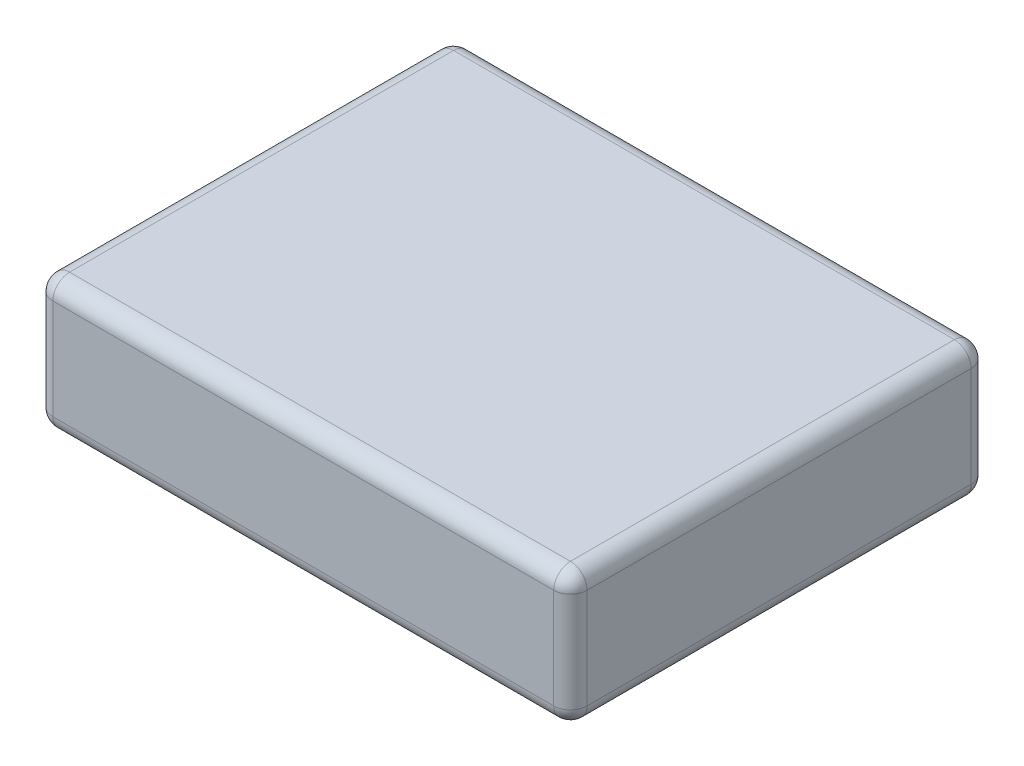
ISO-10303-21;
HEADER;
FILE_DESCRIPTION(('STEP AP214'),'2;1');
FILE_NAME('part.step','',(''),(''),'','','');
FILE_SCHEMA(('AUTOMOTIVE_DESIGN { 1 0 10303 214 1 1 1 1 }'));
ENDSEC;
DATA;
#1=APPLICATION_CONTEXT('core data for automotive mechanical design processes');
#2=APPLICATION_PROTOCOL_DEFINITION('international standard','automotive_design',2000,#1);
#3=PRODUCT_CONTEXT('',#1,'mechanical');
#4=PRODUCT('Part','Part','',(#3));
#5=PRODUCT_RELATED_PRODUCT_CATEGORY('part','',(#4));
#6=PRODUCT_DEFINITION_FORMATION('','',#4);
#7=PRODUCT_DEFINITION_CONTEXT('part definition',#1,'design');
#8=PRODUCT_DEFINITION('design','',#6,#7);
#9=PRODUCT_DEFINITION_SHAPE('','',#8);
#10=(LENGTH_UNIT() NAMED_UNIT(*) SI_UNIT(.MILLI.,.METRE.));
#11=(NAMED_UNIT(*) PLANE_ANGLE_UNIT() SI_UNIT($,.RADIAN.));
#12=(NAMED_UNIT(*) SI_UNIT($,.STERADIAN.) SOLID_ANGLE_UNIT());
#13=UNCERTAINTY_MEASURE_WITH_UNIT(LENGTH_MEASURE(1.E-05),#10,'distance_accuracy_value','');
#14=(GEOMETRIC_REPRESENTATION_CONTEXT(3) GLOBAL_UNCERTAINTY_ASSIGNED_CONTEXT((#13)) GLOBAL_UNIT_ASSIGNED_CONTEXT((#10,
#11,#12)) REPRESENTATION_CONTEXT('',''));
#15=CARTESIAN_POINT('',(0.,0.,0.));
#16=DIRECTION('',(0.,0.,1.));
#17=DIRECTION('',(1.,0.,0.));
#18=AXIS2_PLACEMENT_3D('',#15,#16,#17);
#19=CARTESIAN_POINT('',(15.,97.,-6.5));
#20=DIRECTION('',(0.,-1.,0.));
#21=DIRECTION('',(1.,0.,0.));
#22=AXIS2_PLACEMENT_3D('',#19,#20,#21);
#23=SPHERICAL_SURFACE('',#22,1.);
#24=CARTESIAN_POINT('',(15.,97.,-6.5));
#25=DIRECTION('',(0.,0.,-1.));
#26=DIRECTION('',(1.,0.,0.));
#27=AXIS2_PLACEMENT_3D('',#24,#25,#26);
#28=CIRCLE('',#27,1.);
#29=CARTESIAN_POINT('',(15.,98.,-6.5));
#30=VERTEX_POINT('',#29);
#31=CARTESIAN_POINT('',(16.,97.,-6.5));
#32=VERTEX_POINT('',#31);
#33=EDGE_CURVE('E10',#30,#32,#28,.T.);
#34=ORIENTED_EDGE('',*,*,#33,.F.);
#35=CARTESIAN_POINT('',(15.,97.,-6.5));
#36=DIRECTION('',(1.,0.,0.));
#37=DIRECTION('',(0.,0.,1.));
#38=AXIS2_PLACEMENT_3D('',#35,#36,#37);
#39=CIRCLE('',#38,1.);
#40=CARTESIAN_POINT('',(15.,97.,-5.5));
#41=VERTEX_POINT('',#40);
#42=EDGE_CURVE('E309',#30,#41,#39,.T.);
#43=ORIENTED_EDGE('',*,*,#42,.T.);
#44=CARTESIAN_POINT('',(15.,97.,-6.5));
#45=DIRECTION('',(0.,-1.,0.));
#46=DIRECTION('',(1.,0.,0.));
#47=AXIS2_PLACEMENT_3D('',#44,#45,#46);
#48=CIRCLE('',#47,1.);
#49=EDGE_CURVE('E317',#32,#41,#48,.T.);
#50=ORIENTED_EDGE('',*,*,#49,.F.);
#51=EDGE_LOOP('',(#34,#43,#50));
#52=FACE_BOUND('',#51,.T.);
#53=ADVANCED_FACE('F16',(#52),#23,.T.);
#54=CARTESIAN_POINT('',(15.,97.,-29.5));
#55=DIRECTION('',(0.,0.,1.));
#56=DIRECTION('',(1.,0.,0.));
#57=AXIS2_PLACEMENT_3D('',#54,#55,#56);
#58=SPHERICAL_SURFACE('',#57,1.);
#59=CARTESIAN_POINT('',(15.,97.,-29.5));
#60=DIRECTION('',(0.,-1.,0.));
#61=DIRECTION('',(1.,0.,0.));
#62=AXIS2_PLACEMENT_3D('',#59,#60,#61);
#63=CIRCLE('',#62,1.);
#64=CARTESIAN_POINT('',(15.,97.,-30.5));
#65=VERTEX_POINT('',#64);
#66=CARTESIAN_POINT('',(16.,97.,-29.5));
#67=VERTEX_POINT('',#66);
#68=EDGE_CURVE('E301',#65,#67,#63,.T.);
#69=ORIENTED_EDGE('',*,*,#68,.F.);
#70=CARTESIAN_POINT('',(15.,97.,-29.5));
#71=DIRECTION('',(1.,0.,0.));
#72=DIRECTION('',(0.,1.,0.));
#73=AXIS2_PLACEMENT_3D('',#70,#71,#72);
#74=CIRCLE('',#73,1.);
#75=CARTESIAN_POINT('',(15.,98.,-29.5));
#76=VERTEX_POINT('',#75);
#77=EDGE_CURVE('E221',#65,#76,#74,.T.);
#78=ORIENTED_EDGE('',*,*,#77,.T.);
#79=CARTESIAN_POINT('',(15.,97.,-29.5));
#80=DIRECTION('',(0.,0.,1.));
#81=DIRECTION('',(1.,0.,0.));
#82=AXIS2_PLACEMENT_3D('',#79,#80,#81);
#83=CIRCLE('',#82,1.);
#84=EDGE_CURVE('E24',#67,#76,#83,.T.);
#85=ORIENTED_EDGE('',*,*,#84,.F.);
#86=EDGE_LOOP('',(#69,#78,#85));
#87=FACE_BOUND('',#86,.T.);
#88=ADVANCED_FACE('F326',(#87),#58,.T.);
#89=CARTESIAN_POINT('',(16.,90.,-30.5));
#90=DIRECTION('',(1.,0.,0.));
#91=DIRECTION('',(0.,1.,0.));
#92=AXIS2_PLACEMENT_3D('',#89,#90,#91);
#93=PLANE('',#92);
#94=DIRECTION('',(0.,0.,1.));
#95=VECTOR('',#94,1.);
#96=CARTESIAN_POINT('',(16.,91.,-30.5));
#97=LINE('',#96,#95);
#98=CARTESIAN_POINT('',(16.,91.,-29.5));
#99=VERTEX_POINT('',#98);
#100=CARTESIAN_POINT('',(16.,91.,-6.5));
#101=VERTEX_POINT('',#100);
#102=EDGE_CURVE('E217',#99,#101,#97,.T.);
#103=ORIENTED_EDGE('',*,*,#102,.F.);
#104=DIRECTION('',(0.,1.,0.));
#105=VECTOR('',#104,1.);
#106=CARTESIAN_POINT('',(16.,90.,-29.5));
#107=LINE('',#106,#105);
#108=EDGE_CURVE('E305',#99,#67,#107,.T.);
#109=ORIENTED_EDGE('',*,*,#108,.T.);
#110=DIRECTION('',(0.,0.,1.));
#111=VECTOR('',#110,1.);
#112=CARTESIAN_POINT('',(16.,97.,-30.5));
#113=LINE('',#112,#111);
#114=EDGE_CURVE('E202',#67,#32,#113,.T.);
#115=ORIENTED_EDGE('',*,*,#114,.T.);
#116=DIRECTION('',(0.,1.,0.));
#117=VECTOR('',#116,1.);
#118=CARTESIAN_POINT('',(16.,90.,-6.5));
#119=LINE('',#118,#117);
#120=EDGE_CURVE('E313',#101,#32,#119,.T.);
#121=ORIENTED_EDGE('',*,*,#120,.F.);
#122=EDGE_LOOP('',(#103,#109,#115,#121));
#123=FACE_BOUND('',#122,.T.);
#124=ADVANCED_FACE('F354',(#123),#93,.T.);
#125=CARTESIAN_POINT('',(15.,91.,-6.5));
#126=DIRECTION('',(0.,0.,-1.));
#127=DIRECTION('',(1.,0.,0.));
#128=AXIS2_PLACEMENT_3D('',#125,#126,#127);
#129=SPHERICAL_SURFACE('',#128,1.);
#130=CARTESIAN_POINT('',(15.,91.,-6.5));
#131=DIRECTION('',(0.,1.,0.));
#132=DIRECTION('',(1.,0.,0.));
#133=AXIS2_PLACEMENT_3D('',#130,#131,#132);
#134=CIRCLE('',#133,1.);
#135=CARTESIAN_POINT('',(15.,91.,-5.5));
#136=VERTEX_POINT('',#135);
#137=EDGE_CURVE('E205',#136,#101,#134,.T.);
#138=ORIENTED_EDGE('',*,*,#137,.F.);
#139=CARTESIAN_POINT('',(15.,91.,-6.5));
#140=DIRECTION('',(1.,0.,0.));
#141=DIRECTION('',(0.,-1.,0.));
#142=AXIS2_PLACEMENT_3D('',#139,#140,#141);
#143=CIRCLE('',#142,1.);
#144=CARTESIAN_POINT('',(15.,90.,-6.5));
#145=VERTEX_POINT('',#144);
#146=EDGE_CURVE('E193',#136,#145,#143,.T.);
#147=ORIENTED_EDGE('',*,*,#146,.T.);
#148=CARTESIAN_POINT('',(15.,91.,-6.5));
#149=DIRECTION('',(0.,0.,-1.));
#150=DIRECTION('',(1.,0.,0.));
#151=AXIS2_PLACEMENT_3D('',#148,#149,#150);
#152=CIRCLE('',#151,1.);
#153=EDGE_CURVE('E210',#101,#145,#152,.T.);
#154=ORIENTED_EDGE('',*,*,#153,.F.);
#155=EDGE_LOOP('',(#138,#147,#154));
#156=FACE_BOUND('',#155,.T.);
#157=ADVANCED_FACE('F358',(#156),#129,.T.);
#158=CARTESIAN_POINT('',(15.,91.,-29.5));
#159=DIRECTION('',(0.,0.,1.));
#160=DIRECTION('',(1.,0.,0.));
#161=AXIS2_PLACEMENT_3D('',#158,#159,#160);
#162=SPHERICAL_SURFACE('',#161,1.);
#163=CARTESIAN_POINT('',(15.,91.,-29.5));
#164=DIRECTION('',(0.,0.,-1.));
#165=DIRECTION('',(1.,0.,0.));
#166=AXIS2_PLACEMENT_3D('',#163,#164,#165);
#167=CIRCLE('',#166,1.);
#168=CARTESIAN_POINT('',(15.,90.,-29.5));
#169=VERTEX_POINT('',#168);
#170=EDGE_CURVE('E213',#99,#169,#167,.T.);
#171=ORIENTED_EDGE('',*,*,#170,.T.);
#172=CARTESIAN_POINT('',(15.,91.,-29.5));
#173=DIRECTION('',(-1.,0.,0.));
#174=DIRECTION('',(0.,-1.,0.));
#175=AXIS2_PLACEMENT_3D('',#172,#173,#174);
#176=CIRCLE('',#175,1.);
#177=CARTESIAN_POINT('',(15.,91.,-30.5));
#178=VERTEX_POINT('',#177);
#179=EDGE_CURVE('E190',#178,#169,#176,.T.);
#180=ORIENTED_EDGE('',*,*,#179,.F.);
#181=CARTESIAN_POINT('',(15.,91.,-29.5));
#182=DIRECTION('',(0.,-1.,0.));
#183=DIRECTION('',(1.,0.,0.));
#184=AXIS2_PLACEMENT_3D('',#181,#182,#183);
#185=CIRCLE('',#184,1.);
#186=EDGE_CURVE('E297',#178,#99,#185,.T.);
#187=ORIENTED_EDGE('',*,*,#186,.T.);
#188=EDGE_LOOP('',(#171,#180,#187));
#189=FACE_BOUND('',#188,.T.);
#190=ADVANCED_FACE('F364',(#189),#162,.T.);
#191=CARTESIAN_POINT('',(15.,97.,-30.5));
#192=DIRECTION('',(0.,0.,1.));
#193=DIRECTION('',(1.,0.,0.));
#194=AXIS2_PLACEMENT_3D('',#191,#192,#193);
#195=CYLINDRICAL_SURFACE('',#194,1.);
#196=ORIENTED_EDGE('',*,*,#114,.F.);
#197=ORIENTED_EDGE('',*,*,#84,.T.);
#198=DIRECTION('',(0.,0.,1.));
#199=VECTOR('',#198,1.);
#200=CARTESIAN_POINT('',(15.,98.,-30.5));
#201=LINE('',#200,#199);
#202=EDGE_CURVE('E287',#76,#30,#201,.T.);
#203=ORIENTED_EDGE('',*,*,#202,.T.);
#204=ORIENTED_EDGE('',*,*,#33,.T.);
#205=EDGE_LOOP('',(#196,#197,#203,#204));
#206=FACE_BOUND('',#205,.T.);
#207=ADVANCED_FACE('F323',(#206),#195,.T.);
#208=CARTESIAN_POINT('',(15.,90.,-6.5));
#209=DIRECTION('',(0.,1.,0.));
#210=DIRECTION('',(1.,0.,0.));
#211=AXIS2_PLACEMENT_3D('',#208,#209,#210);
#212=CYLINDRICAL_SURFACE('',#211,1.);
#213=ORIENTED_EDGE('',*,*,#120,.T.);
#214=ORIENTED_EDGE('',*,*,#49,.T.);
#215=DIRECTION('',(0.,1.,0.));
#216=VECTOR('',#215,1.);
#217=CARTESIAN_POINT('',(15.,90.,-5.5));
#218=LINE('',#217,#216);
#219=EDGE_CURVE('E269',#136,#41,#218,.T.);
#220=ORIENTED_EDGE('',*,*,#219,.F.);
#221=ORIENTED_EDGE('',*,*,#137,.T.);
#222=EDGE_LOOP('',(#213,#214,#220,#221));
#223=FACE_BOUND('',#222,.T.);
#224=ADVANCED_FACE('F345',(#223),#212,.T.);
#225=CARTESIAN_POINT('',(-16.,97.,-6.5));
#226=DIRECTION('',(1.,0.,0.));
#227=DIRECTION('',(0.,1.,0.));
#228=AXIS2_PLACEMENT_3D('',#225,#226,#227);
#229=CYLINDRICAL_SURFACE('',#228,1.);
#230=CARTESIAN_POINT('',(-15.,97.,-6.5));
#231=DIRECTION('',(1.,0.,0.));
#232=DIRECTION('',(0.,0.,1.));
#233=AXIS2_PLACEMENT_3D('',#230,#231,#232);
#234=CIRCLE('',#233,1.);
#235=CARTESIAN_POINT('',(-15.,98.,-6.5));
#236=VERTEX_POINT('',#235);
#237=CARTESIAN_POINT('',(-15.,97.,-5.5));
#238=VERTEX_POINT('',#237);
#239=EDGE_CURVE('E277',#236,#238,#234,.T.);
#240=ORIENTED_EDGE('',*,*,#239,.T.);
#241=DIRECTION('',(1.,0.,0.));
#242=VECTOR('',#241,1.);
#243=CARTESIAN_POINT('',(-16.,97.,-5.5));
#244=LINE('',#243,#242);
#245=EDGE_CURVE('E273',#238,#41,#244,.T.);
#246=ORIENTED_EDGE('',*,*,#245,.T.);
#247=ORIENTED_EDGE('',*,*,#42,.F.);
#248=DIRECTION('',(1.,0.,0.));
#249=VECTOR('',#248,1.);
#250=CARTESIAN_POINT('',(-16.,98.,-6.5));
#251=LINE('',#250,#249);
#252=EDGE_CURVE('E280',#236,#30,#251,.T.);
#253=ORIENTED_EDGE('',*,*,#252,.F.);
#254=EDGE_LOOP('',(#240,#246,#247,#253));
#255=FACE_BOUND('',#254,.T.);
#256=ADVANCED_FACE('F337',(#255),#229,.T.);
#257=CARTESIAN_POINT('',(15.,90.,-29.5));
#258=DIRECTION('',(0.,1.,0.));
#259=DIRECTION('',(1.,0.,0.));
#260=AXIS2_PLACEMENT_3D('',#257,#258,#259);
#261=CYLINDRICAL_SURFACE('',#260,1.);
#262=ORIENTED_EDGE('',*,*,#186,.F.);
#263=DIRECTION('',(0.,1.,0.));
#264=VECTOR('',#263,1.);
#265=CARTESIAN_POINT('',(15.,90.,-30.5));
#266=LINE('',#265,#264);
#267=EDGE_CURVE('E259',#178,#65,#266,.T.);
#268=ORIENTED_EDGE('',*,*,#267,.T.);
#269=ORIENTED_EDGE('',*,*,#68,.T.);
#270=ORIENTED_EDGE('',*,*,#108,.F.);
#271=EDGE_LOOP('',(#262,#268,#269,#270));
#272=FACE_BOUND('',#271,.T.);
#273=ADVANCED_FACE('F373',(#272),#261,.T.);
#274=CARTESIAN_POINT('',(-16.,97.,-29.5));
#275=DIRECTION('',(1.,0.,0.));
#276=DIRECTION('',(0.,1.,0.));
#277=AXIS2_PLACEMENT_3D('',#274,#275,#276);
#278=CYLINDRICAL_SURFACE('',#277,1.);
#279=DIRECTION('',(1.,0.,0.));
#280=VECTOR('',#279,1.);
#281=CARTESIAN_POINT('',(-16.,98.,-29.5));
#282=LINE('',#281,#280);
#283=CARTESIAN_POINT('',(-15.,98.,-29.5));
#284=VERTEX_POINT('',#283);
#285=EDGE_CURVE('E194',#284,#76,#282,.T.);
#286=ORIENTED_EDGE('',*,*,#285,.T.);
#287=ORIENTED_EDGE('',*,*,#77,.F.);
#288=DIRECTION('',(1.,0.,0.));
#289=VECTOR('',#288,1.);
#290=CARTESIAN_POINT('',(-16.,97.,-30.5));
#291=LINE('',#290,#289);
#292=CARTESIAN_POINT('',(-15.,97.,-30.5));
#293=VERTEX_POINT('',#292);
#294=EDGE_CURVE('E255',#293,#65,#291,.T.);
#295=ORIENTED_EDGE('',*,*,#294,.F.);
#296=CARTESIAN_POINT('',(-15.,97.,-29.5));
#297=DIRECTION('',(1.,0.,0.));
#298=DIRECTION('',(0.,1.,0.));
#299=AXIS2_PLACEMENT_3D('',#296,#297,#298);
#300=CIRCLE('',#299,1.);
#301=EDGE_CURVE('E183',#293,#284,#300,.T.);
#302=ORIENTED_EDGE('',*,*,#301,.T.);
#303=EDGE_LOOP('',(#286,#287,#295,#302));
#304=FACE_BOUND('',#303,.T.);
#305=ADVANCED_FACE('F329',(#304),#278,.T.);
#306=CARTESIAN_POINT('',(15.,91.,-30.5));
#307=DIRECTION('',(0.,0.,1.));
#308=DIRECTION('',(1.,0.,0.));
#309=AXIS2_PLACEMENT_3D('',#306,#307,#308);
#310=CYLINDRICAL_SURFACE('',#309,1.);
#311=ORIENTED_EDGE('',*,*,#153,.T.);
#312=DIRECTION('',(0.,0.,1.));
#313=VECTOR('',#312,1.);
#314=CARTESIAN_POINT('',(15.,90.,-30.5));
#315=LINE('',#314,#313);
#316=EDGE_CURVE('E247',#169,#145,#315,.T.);
#317=ORIENTED_EDGE('',*,*,#316,.F.);
#318=ORIENTED_EDGE('',*,*,#170,.F.);
#319=ORIENTED_EDGE('',*,*,#102,.T.);
#320=EDGE_LOOP('',(#311,#317,#318,#319));
#321=FACE_BOUND('',#320,.T.);
#322=ADVANCED_FACE('F376',(#321),#310,.T.);
#323=CARTESIAN_POINT('',(-16.,91.,-6.5));
#324=DIRECTION('',(1.,0.,0.));
#325=DIRECTION('',(0.,-1.,0.));
#326=AXIS2_PLACEMENT_3D('',#323,#324,#325);
#327=CYLINDRICAL_SURFACE('',#326,1.);
#328=DIRECTION('',(1.,0.,0.));
#329=VECTOR('',#328,1.);
#330=CARTESIAN_POINT('',(-16.,90.,-6.5));
#331=LINE('',#330,#329);
#332=CARTESIAN_POINT('',(-15.,90.,-6.5));
#333=VERTEX_POINT('',#332);
#334=EDGE_CURVE('E251',#333,#145,#331,.T.);
#335=ORIENTED_EDGE('',*,*,#334,.T.);
#336=ORIENTED_EDGE('',*,*,#146,.F.);
#337=DIRECTION('',(1.,0.,0.));
#338=VECTOR('',#337,1.);
#339=CARTESIAN_POINT('',(-16.,91.,-5.5));
#340=LINE('',#339,#338);
#341=CARTESIAN_POINT('',(-15.,91.,-5.5));
#342=VERTEX_POINT('',#341);
#343=EDGE_CURVE('E185',#342,#136,#340,.T.);
#344=ORIENTED_EDGE('',*,*,#343,.F.);
#345=CARTESIAN_POINT('',(-15.,91.,-6.5));
#346=DIRECTION('',(1.,0.,0.));
#347=DIRECTION('',(0.,-1.,0.));
#348=AXIS2_PLACEMENT_3D('',#345,#346,#347);
#349=CIRCLE('',#348,1.);
#350=EDGE_CURVE('E139',#342,#333,#349,.T.);
#351=ORIENTED_EDGE('',*,*,#350,.T.);
#352=EDGE_LOOP('',(#335,#336,#344,#351));
#353=FACE_BOUND('',#352,.T.);
#354=ADVANCED_FACE('F379',(#353),#327,.T.);
#355=CARTESIAN_POINT('',(-16.,91.,-29.5));
#356=DIRECTION('',(1.,0.,0.));
#357=DIRECTION('',(0.,-1.,0.));
#358=AXIS2_PLACEMENT_3D('',#355,#356,#357);
#359=CYLINDRICAL_SURFACE('',#358,1.);
#360=CARTESIAN_POINT('',(-15.,91.,-29.5));
#361=DIRECTION('',(-1.,0.,0.));
#362=DIRECTION('',(0.,-1.,0.));
#363=AXIS2_PLACEMENT_3D('',#360,#361,#362);
#364=CIRCLE('',#363,1.);
#365=CARTESIAN_POINT('',(-15.,91.,-30.5));
#366=VERTEX_POINT('',#365);
#367=CARTESIAN_POINT('',(-15.,90.,-29.5));
#368=VERTEX_POINT('',#367);
#369=EDGE_CURVE('E227',#366,#368,#364,.T.);
#370=ORIENTED_EDGE('',*,*,#369,.F.);
#371=DIRECTION('',(1.,0.,0.));
#372=VECTOR('',#371,1.);
#373=CARTESIAN_POINT('',(-16.,91.,-30.5));
#374=LINE('',#373,#372);
#375=EDGE_CURVE('E186',#366,#178,#374,.T.);
#376=ORIENTED_EDGE('',*,*,#375,.T.);
#377=ORIENTED_EDGE('',*,*,#179,.T.);
#378=DIRECTION('',(1.,0.,0.));
#379=VECTOR('',#378,1.);
#380=CARTESIAN_POINT('',(-16.,90.,-29.5));
#381=LINE('',#380,#379);
#382=EDGE_CURVE('E226',#368,#169,#381,.T.);
#383=ORIENTED_EDGE('',*,*,#382,.F.);
#384=EDGE_LOOP('',(#370,#376,#377,#383));
#385=FACE_BOUND('',#384,.T.);
#386=ADVANCED_FACE('F383',(#385),#359,.T.);
#387=CARTESIAN_POINT('',(-16.,98.,-30.5));
#388=DIRECTION('',(0.,1.,0.));
#389=DIRECTION('',(1.,0.,0.));
#390=AXIS2_PLACEMENT_3D('',#387,#388,#389);
#391=PLANE('',#390);
#392=DIRECTION('',(0.,0.,1.));
#393=VECTOR('',#392,1.);
#394=CARTESIAN_POINT('',(-15.,98.,-30.5));
#395=LINE('',#394,#393);
#396=EDGE_CURVE('E231',#284,#236,#395,.T.);
#397=ORIENTED_EDGE('',*,*,#396,.T.);
#398=ORIENTED_EDGE('',*,*,#252,.T.);
#399=ORIENTED_EDGE('',*,*,#202,.F.);
#400=ORIENTED_EDGE('',*,*,#285,.F.);
#401=EDGE_LOOP('',(#397,#398,#399,#400));
#402=FACE_BOUND('',#401,.T.);
#403=ADVANCED_FACE('F331',(#402),#391,.T.);
#404=CARTESIAN_POINT('',(-15.,97.,-6.5));
#405=DIRECTION('',(0.,-1.,0.));
#406=DIRECTION('',(-1.,0.,0.));
#407=AXIS2_PLACEMENT_3D('',#404,#405,#406);
#408=SPHERICAL_SURFACE('',#407,1.);
#409=CARTESIAN_POINT('',(-15.,97.,-6.5));
#410=DIRECTION('',(0.,1.,0.));
#411=DIRECTION('',(-1.,0.,0.));
#412=AXIS2_PLACEMENT_3D('',#409,#410,#411);
#413=CIRCLE('',#412,1.);
#414=CARTESIAN_POINT('',(-16.,97.,-6.5));
#415=VERTEX_POINT('',#414);
#416=EDGE_CURVE('E173',#415,#238,#413,.T.);
#417=ORIENTED_EDGE('',*,*,#416,.T.);
#418=ORIENTED_EDGE('',*,*,#239,.F.);
#419=CARTESIAN_POINT('',(-15.,97.,-6.5));
#420=DIRECTION('',(0.,0.,1.));
#421=DIRECTION('',(-1.,0.,0.));
#422=AXIS2_PLACEMENT_3D('',#419,#420,#421);
#423=CIRCLE('',#422,1.);
#424=EDGE_CURVE('E228',#236,#415,#423,.T.);
#425=ORIENTED_EDGE('',*,*,#424,.T.);
#426=EDGE_LOOP('',(#417,#418,#425));
#427=FACE_BOUND('',#426,.T.);
#428=ADVANCED_FACE('F340',(#427),#408,.T.);
#429=CARTESIAN_POINT('',(-16.,90.,-5.5));
#430=DIRECTION('',(0.,0.,1.));
#431=DIRECTION('',(1.,0.,0.));
#432=AXIS2_PLACEMENT_3D('',#429,#430,#431);
#433=PLANE('',#432);
#434=DIRECTION('',(0.,1.,0.));
#435=VECTOR('',#434,1.);
#436=CARTESIAN_POINT('',(-15.,90.,-5.5));
#437=LINE('',#436,#435);
#438=EDGE_CURVE('E145',#342,#238,#437,.T.);
#439=ORIENTED_EDGE('',*,*,#438,.F.);
#440=ORIENTED_EDGE('',*,*,#343,.T.);
#441=ORIENTED_EDGE('',*,*,#219,.T.);
#442=ORIENTED_EDGE('',*,*,#245,.F.);
#443=EDGE_LOOP('',(#439,#440,#441,#442));
#444=FACE_BOUND('',#443,.T.);
#445=ADVANCED_FACE('F342',(#444),#433,.T.);
#446=CARTESIAN_POINT('',(-15.,97.,-29.5));
#447=DIRECTION('',(0.,0.,1.));
#448=DIRECTION('',(-1.,0.,0.));
#449=AXIS2_PLACEMENT_3D('',#446,#447,#448);
#450=SPHERICAL_SURFACE('',#449,1.);
#451=CARTESIAN_POINT('',(-15.,97.,-29.5));
#452=DIRECTION('',(0.,0.,-1.));
#453=DIRECTION('',(-1.,0.,0.));
#454=AXIS2_PLACEMENT_3D('',#451,#452,#453);
#455=CIRCLE('',#454,1.);
#456=CARTESIAN_POINT('',(-16.,97.,-29.5));
#457=VERTEX_POINT('',#456);
#458=EDGE_CURVE('E234',#457,#284,#455,.T.);
#459=ORIENTED_EDGE('',*,*,#458,.T.);
#460=ORIENTED_EDGE('',*,*,#301,.F.);
#461=CARTESIAN_POINT('',(-15.,97.,-29.5));
#462=DIRECTION('',(0.,1.,0.));
#463=DIRECTION('',(-1.,0.,0.));
#464=AXIS2_PLACEMENT_3D('',#461,#462,#463);
#465=CIRCLE('',#464,1.);
#466=EDGE_CURVE('E158',#293,#457,#465,.T.);
#467=ORIENTED_EDGE('',*,*,#466,.T.);
#468=EDGE_LOOP('',(#459,#460,#467));
#469=FACE_BOUND('',#468,.T.);
#470=ADVANCED_FACE('F395',(#469),#450,.T.);
#471=CARTESIAN_POINT('',(-16.,90.,-30.5));
#472=DIRECTION('',(0.,0.,1.));
#473=DIRECTION('',(1.,0.,0.));
#474=AXIS2_PLACEMENT_3D('',#471,#472,#473);
#475=PLANE('',#474);
#476=ORIENTED_EDGE('',*,*,#294,.T.);
#477=ORIENTED_EDGE('',*,*,#267,.F.);
#478=ORIENTED_EDGE('',*,*,#375,.F.);
#479=DIRECTION('',(0.,1.,0.));
#480=VECTOR('',#479,1.);
#481=CARTESIAN_POINT('',(-15.,90.,-30.5));
#482=LINE('',#481,#480);
#483=EDGE_CURVE('E206',#366,#293,#482,.T.);
#484=ORIENTED_EDGE('',*,*,#483,.T.);
#485=EDGE_LOOP('',(#476,#477,#478,#484));
#486=FACE_BOUND('',#485,.T.);
#487=ADVANCED_FACE('F398',(#486),#475,.F.);
#488=CARTESIAN_POINT('',(-16.,90.,-30.5));
#489=DIRECTION('',(0.,1.,0.));
#490=DIRECTION('',(1.,0.,0.));
#491=AXIS2_PLACEMENT_3D('',#488,#489,#490);
#492=PLANE('',#491);
#493=ORIENTED_EDGE('',*,*,#382,.T.);
#494=ORIENTED_EDGE('',*,*,#316,.T.);
#495=ORIENTED_EDGE('',*,*,#334,.F.);
#496=DIRECTION('',(0.,0.,1.));
#497=VECTOR('',#496,1.);
#498=CARTESIAN_POINT('',(-15.,90.,-30.5));
#499=LINE('',#498,#497);
#500=EDGE_CURVE('E156',#368,#333,#499,.T.);
#501=ORIENTED_EDGE('',*,*,#500,.F.);
#502=EDGE_LOOP('',(#493,#494,#495,#501));
#503=FACE_BOUND('',#502,.T.);
#504=ADVANCED_FACE('F402',(#503),#492,.F.);
#505=CARTESIAN_POINT('',(-15.,91.,-6.5));
#506=DIRECTION('',(0.,0.,-1.));
#507=DIRECTION('',(-1.,0.,0.));
#508=AXIS2_PLACEMENT_3D('',#505,#506,#507);
#509=SPHERICAL_SURFACE('',#508,1.);
#510=CARTESIAN_POINT('',(-15.,91.,-6.5));
#511=DIRECTION('',(0.,0.,1.));
#512=DIRECTION('',(-1.,0.,0.));
#513=AXIS2_PLACEMENT_3D('',#510,#511,#512);
#514=CIRCLE('',#513,1.);
#515=CARTESIAN_POINT('',(-16.,91.,-6.5));
#516=VERTEX_POINT('',#515);
#517=EDGE_CURVE('E136',#516,#333,#514,.T.);
#518=ORIENTED_EDGE('',*,*,#517,.T.);
#519=ORIENTED_EDGE('',*,*,#350,.F.);
#520=CARTESIAN_POINT('',(-15.,91.,-6.5));
#521=DIRECTION('',(0.,-1.,0.));
#522=DIRECTION('',(-1.,0.,0.));
#523=AXIS2_PLACEMENT_3D('',#520,#521,#522);
#524=CIRCLE('',#523,1.);
#525=EDGE_CURVE('E133',#342,#516,#524,.T.);
#526=ORIENTED_EDGE('',*,*,#525,.T.);
#527=EDGE_LOOP('',(#518,#519,#526));
#528=FACE_BOUND('',#527,.T.);
#529=ADVANCED_FACE('F135',(#528),#509,.T.);
#530=CARTESIAN_POINT('',(-15.,91.,-29.5));
#531=DIRECTION('',(0.,0.,1.));
#532=DIRECTION('',(-1.,0.,0.));
#533=AXIS2_PLACEMENT_3D('',#530,#531,#532);
#534=SPHERICAL_SURFACE('',#533,1.);
#535=CARTESIAN_POINT('',(-15.,91.,-29.5));
#536=DIRECTION('',(0.,1.,0.));
#537=DIRECTION('',(-1.,0.,0.));
#538=AXIS2_PLACEMENT_3D('',#535,#536,#537);
#539=CIRCLE('',#538,1.);
#540=CARTESIAN_POINT('',(-16.,91.,-29.5));
#541=VERTEX_POINT('',#540);
#542=EDGE_CURVE('E146',#366,#541,#539,.T.);
#543=ORIENTED_EDGE('',*,*,#542,.F.);
#544=ORIENTED_EDGE('',*,*,#369,.T.);
#545=CARTESIAN_POINT('',(-15.,91.,-29.5));
#546=DIRECTION('',(0.,0.,1.));
#547=DIRECTION('',(-1.,0.,0.));
#548=AXIS2_PLACEMENT_3D('',#545,#546,#547);
#549=CIRCLE('',#548,1.);
#550=EDGE_CURVE('E168',#541,#368,#549,.T.);
#551=ORIENTED_EDGE('',*,*,#550,.F.);
#552=EDGE_LOOP('',(#543,#544,#551));
#553=FACE_BOUND('',#552,.T.);
#554=ADVANCED_FACE('F404',(#553),#534,.T.);
#555=CARTESIAN_POINT('',(-15.,97.,-30.5));
#556=DIRECTION('',(0.,0.,1.));
#557=DIRECTION('',(-1.,0.,0.));
#558=AXIS2_PLACEMENT_3D('',#555,#556,#557);
#559=CYLINDRICAL_SURFACE('',#558,1.);
#560=ORIENTED_EDGE('',*,*,#424,.F.);
#561=ORIENTED_EDGE('',*,*,#396,.F.);
#562=ORIENTED_EDGE('',*,*,#458,.F.);
#563=DIRECTION('',(0.,0.,1.));
#564=VECTOR('',#563,1.);
#565=CARTESIAN_POINT('',(-16.,97.,-30.5));
#566=LINE('',#565,#564);
#567=EDGE_CURVE('E176',#457,#415,#566,.T.);
#568=ORIENTED_EDGE('',*,*,#567,.T.);
#569=EDGE_LOOP('',(#560,#561,#562,#568));
#570=FACE_BOUND('',#569,.T.);
#571=ADVANCED_FACE('F407',(#570),#559,.T.);
#572=CARTESIAN_POINT('',(-15.,90.,-6.5));
#573=DIRECTION('',(0.,1.,0.));
#574=DIRECTION('',(-1.,0.,0.));
#575=AXIS2_PLACEMENT_3D('',#572,#573,#574);
#576=CYLINDRICAL_SURFACE('',#575,1.);
#577=ORIENTED_EDGE('',*,*,#525,.F.);
#578=ORIENTED_EDGE('',*,*,#438,.T.);
#579=ORIENTED_EDGE('',*,*,#416,.F.);
#580=DIRECTION('',(0.,1.,0.));
#581=VECTOR('',#580,1.);
#582=CARTESIAN_POINT('',(-16.,90.,-6.5));
#583=LINE('',#582,#581);
#584=EDGE_CURVE('E164',#516,#415,#583,.T.);
#585=ORIENTED_EDGE('',*,*,#584,.F.);
#586=EDGE_LOOP('',(#577,#578,#579,#585));
#587=FACE_BOUND('',#586,.T.);
#588=ADVANCED_FACE('F171',(#587),#576,.T.);
#589=CARTESIAN_POINT('',(-15.,90.,-29.5));
#590=DIRECTION('',(0.,1.,0.));
#591=DIRECTION('',(-1.,0.,0.));
#592=AXIS2_PLACEMENT_3D('',#589,#590,#591);
#593=CYLINDRICAL_SURFACE('',#592,1.);
#594=DIRECTION('',(0.,1.,0.));
#595=VECTOR('',#594,1.);
#596=CARTESIAN_POINT('',(-16.,90.,-29.5));
#597=LINE('',#596,#595);
#598=EDGE_CURVE('E166',#541,#457,#597,.T.);
#599=ORIENTED_EDGE('',*,*,#598,.T.);
#600=ORIENTED_EDGE('',*,*,#466,.F.);
#601=ORIENTED_EDGE('',*,*,#483,.F.);
#602=ORIENTED_EDGE('',*,*,#542,.T.);
#603=EDGE_LOOP('',(#599,#600,#601,#602));
#604=FACE_BOUND('',#603,.T.);
#605=ADVANCED_FACE('F418',(#604),#593,.T.);
#606=CARTESIAN_POINT('',(-15.,91.,-30.5));
#607=DIRECTION('',(0.,0.,1.));
#608=DIRECTION('',(-1.,0.,0.));
#609=AXIS2_PLACEMENT_3D('',#606,#607,#608);
#610=CYLINDRICAL_SURFACE('',#609,1.);
#611=DIRECTION('',(0.,0.,1.));
#612=VECTOR('',#611,1.);
#613=CARTESIAN_POINT('',(-16.,91.,-30.5));
#614=LINE('',#613,#612);
#615=EDGE_CURVE('E153',#541,#516,#614,.T.);
#616=ORIENTED_EDGE('',*,*,#615,.F.);
#617=ORIENTED_EDGE('',*,*,#550,.T.);
#618=ORIENTED_EDGE('',*,*,#500,.T.);
#619=ORIENTED_EDGE('',*,*,#517,.F.);
#620=EDGE_LOOP('',(#616,#617,#618,#619));
#621=FACE_BOUND('',#620,.T.);
#622=ADVANCED_FACE('F151',(#621),#610,.T.);
#623=CARTESIAN_POINT('',(-16.,90.,-30.5));
#624=DIRECTION('',(1.,0.,0.));
#625=DIRECTION('',(0.,1.,0.));
#626=AXIS2_PLACEMENT_3D('',#623,#624,#625);
#627=PLANE('',#626);
#628=ORIENTED_EDGE('',*,*,#584,.T.);
#629=ORIENTED_EDGE('',*,*,#567,.F.);
#630=ORIENTED_EDGE('',*,*,#598,.F.);
#631=ORIENTED_EDGE('',*,*,#615,.T.);
#632=EDGE_LOOP('',(#628,#629,#630,#631));
#633=FACE_BOUND('',#632,.T.);
#634=ADVANCED_FACE('F162',(#633),#627,.F.);
#635=CLOSED_SHELL('',(#53,#88,#124,#157,#190,#207,#224,#256,#273,#305,#322,#354,#386,#403,#428,
#445,#470,#487,#504,#529,#554,#571,#588,#605,#622,#634));
#636=MANIFOLD_SOLID_BREP('B1',#635);
#637=ADVANCED_BREP_SHAPE_REPRESENTATION('',(#18,#636),#14);
#638=SHAPE_DEFINITION_REPRESENTATION(#9,#637);
ENDSEC;
END-ISO-10303-21;
